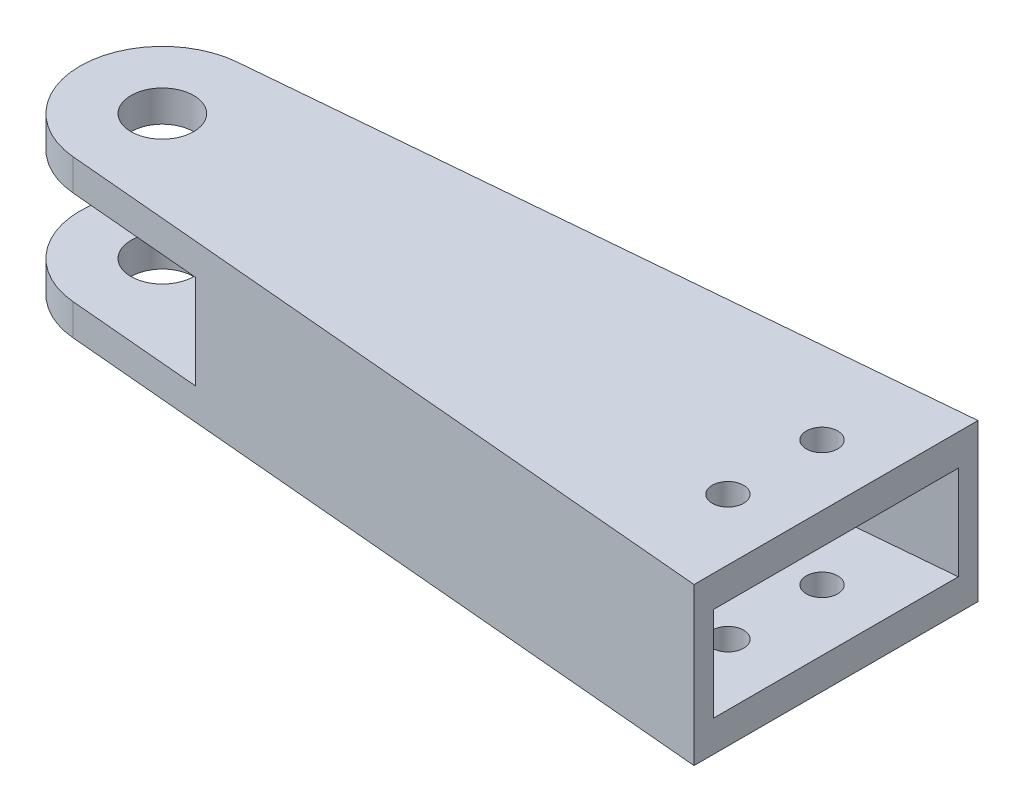
ISO-10303-21;
HEADER;
FILE_DESCRIPTION(('STEP AP214'),'2;1');
FILE_NAME('part.step','',(''),(''),'','','');
FILE_SCHEMA(('AUTOMOTIVE_DESIGN { 1 0 10303 214 1 1 1 1 }'));
ENDSEC;
DATA;
#1=APPLICATION_CONTEXT('core data for automotive mechanical design processes');
#2=APPLICATION_PROTOCOL_DEFINITION('international standard','automotive_design',2000,#1);
#3=PRODUCT_CONTEXT('',#1,'mechanical');
#4=PRODUCT('Part','Part','',(#3));
#5=PRODUCT_RELATED_PRODUCT_CATEGORY('part','',(#4));
#6=PRODUCT_DEFINITION_FORMATION('','',#4);
#7=PRODUCT_DEFINITION_CONTEXT('part definition',#1,'design');
#8=PRODUCT_DEFINITION('design','',#6,#7);
#9=PRODUCT_DEFINITION_SHAPE('','',#8);
#10=(LENGTH_UNIT() NAMED_UNIT(*) SI_UNIT(.MILLI.,.METRE.));
#11=(NAMED_UNIT(*) PLANE_ANGLE_UNIT() SI_UNIT($,.RADIAN.));
#12=(NAMED_UNIT(*) SI_UNIT($,.STERADIAN.) SOLID_ANGLE_UNIT());
#13=UNCERTAINTY_MEASURE_WITH_UNIT(LENGTH_MEASURE(1.E-05),#10,'distance_accuracy_value','');
#14=(GEOMETRIC_REPRESENTATION_CONTEXT(3) GLOBAL_UNCERTAINTY_ASSIGNED_CONTEXT((#13)) GLOBAL_UNIT_ASSIGNED_CONTEXT((#10,
#11,#12)) REPRESENTATION_CONTEXT('',''));
#15=CARTESIAN_POINT('',(0.,0.,0.));
#16=DIRECTION('',(0.,0.,1.));
#17=DIRECTION('',(1.,0.,0.));
#18=AXIS2_PLACEMENT_3D('',#15,#16,#17);
#19=CARTESIAN_POINT('',(0.,4.,0.));
#20=DIRECTION('',(0.,1.,0.));
#21=DIRECTION('',(0.,0.,1.));
#22=AXIS2_PLACEMENT_3D('',#19,#20,#21);
#23=PLANE('',#22);
#24=CARTESIAN_POINT('',(-160.9,4.,0.));
#25=DIRECTION('',(0.,1.,0.));
#26=DIRECTION('',(0.,0.,1.));
#27=AXIS2_PLACEMENT_3D('',#24,#25,#26);
#28=CIRCLE('',#27,3.99999999999999);
#29=CARTESIAN_POINT('',(-160.9,4.,3.99999999999999));
#30=VERTEX_POINT('',#29);
#31=EDGE_CURVE('E187',#30,#30,#28,.T.);
#32=ORIENTED_EDGE('',*,*,#31,.F.);
#33=EDGE_LOOP('',(#32));
#34=FACE_BOUND('',#33,.T.);
#35=DIRECTION('',(-0.0877327517225247,0.,0.996144047954509));
#36=VECTOR('',#35,1.);
#37=CARTESIAN_POINT('',(-142.570436415608,4.,-12.5565140169303));
#38=LINE('',#37,#36);
#39=CARTESIAN_POINT('',(-144.510751477509,4.,9.47440672955096));
#40=VERTEX_POINT('',#39);
#41=CARTESIAN_POINT('',(-144.730083356816,4.,11.9647668494372));
#42=VERTEX_POINT('',#41);
#43=EDGE_CURVE('E174',#40,#42,#38,.T.);
#44=ORIENTED_EDGE('',*,*,#43,.F.);
#45=DIRECTION('',(0.,0.,1.));
#46=VECTOR('',#45,1.);
#47=CARTESIAN_POINT('',(-144.510751477509,4.,-9.47440672955096));
#48=LINE('',#47,#46);
#49=CARTESIAN_POINT('',(-144.510751477509,4.,-9.47440672955096));
#50=VERTEX_POINT('',#49);
#51=EDGE_CURVE('E154',#50,#40,#48,.T.);
#52=ORIENTED_EDGE('',*,*,#51,.F.);
#53=DIRECTION('',(0.0877327517225137,0.,0.996144047954509));
#54=VECTOR('',#53,1.);
#55=CARTESIAN_POINT('',(-142.570436415608,4.,12.5565140169288));
#56=LINE('',#55,#54);
#57=CARTESIAN_POINT('',(-144.730083356816,4.,-11.9647668494372));
#58=VERTEX_POINT('',#57);
#59=EDGE_CURVE('E60',#58,#50,#56,.T.);
#60=ORIENTED_EDGE('',*,*,#59,.F.);
#61=DIRECTION('',(0.996144047954509,0.,-0.0877327517225177));
#62=VECTOR('',#61,1.);
#63=CARTESIAN_POINT('',(-2.15964694120755,4.,-24.5212808663666));
#64=LINE('',#63,#62);
#65=CARTESIAN_POINT('',(-161.821193893086,4.,-10.4595125035224));
#66=VERTEX_POINT('',#65);
#67=EDGE_CURVE('E178',#66,#58,#64,.T.);
#68=ORIENTED_EDGE('',*,*,#67,.F.);
#69=CARTESIAN_POINT('',(-160.9,4.,0.));
#70=DIRECTION('',(0.,1.,0.));
#71=DIRECTION('',(0.,0.,1.));
#72=AXIS2_PLACEMENT_3D('',#69,#70,#71);
#73=CIRCLE('',#72,10.5);
#74=CARTESIAN_POINT('',(-161.821193893086,4.,10.4595125035224));
#75=VERTEX_POINT('',#74);
#76=EDGE_CURVE('E180',#66,#75,#73,.T.);
#77=ORIENTED_EDGE('',*,*,#76,.T.);
#78=DIRECTION('',(0.996144047954509,0.,0.0877327517225177));
#79=VECTOR('',#78,1.);
#80=CARTESIAN_POINT('',(-2.15964694120755,4.,24.5212808663666));
#81=LINE('',#80,#79);
#82=EDGE_CURVE('E183',#75,#42,#81,.T.);
#83=ORIENTED_EDGE('',*,*,#82,.T.);
#84=EDGE_LOOP('',(#44,#52,#60,#68,#77,#83));
#85=FACE_BOUND('',#84,.T.);
#86=ADVANCED_FACE('F37',(#34,#85),#23,.T.);
#87=CARTESIAN_POINT('',(-82.7999999999479,4.,-6.01761447089224));
#88=DIRECTION('',(0.,1.,0.));
#89=DIRECTION('',(0.,0.,1.));
#90=AXIS2_PLACEMENT_3D('',#87,#88,#89);
#91=CIRCLE('',#90,2.);
#92=CARTESIAN_POINT('',(-82.7999999999479,4.,-4.01761447089224));
#93=VERTEX_POINT('',#92);
#94=EDGE_CURVE('E407',#93,#93,#91,.T.);
#95=ORIENTED_EDGE('',*,*,#94,.F.);
#96=EDGE_LOOP('',(#95));
#97=FACE_BOUND('',#96,.T.);
#98=CARTESIAN_POINT('',(-82.7999999999479,4.,5.98238552910776));
#99=DIRECTION('',(0.,1.,0.));
#100=DIRECTION('',(0.,0.,1.));
#101=AXIS2_PLACEMENT_3D('',#98,#99,#100);
#102=CIRCLE('',#101,2.);
#103=CARTESIAN_POINT('',(-82.7999999999479,4.,7.98238552910776));
#104=VERTEX_POINT('',#103);
#105=EDGE_CURVE('E275',#104,#104,#102,.T.);
#106=ORIENTED_EDGE('',*,*,#105,.F.);
#107=EDGE_LOOP('',(#106));
#108=FACE_BOUND('',#107,.T.);
#109=DIRECTION('',(-0.996144047954509,0.,0.0877327517225177));
#110=VECTOR('',#109,1.);
#111=CARTESIAN_POINT('',(-1.94031506190126,4.,-22.0309207464803));
#112=LINE('',#111,#110);
#113=CARTESIAN_POINT('',(-75.,4.,-15.5963822751002));
#114=VERTEX_POINT('',#113);
#115=CARTESIAN_POINT('',(-95.,4.,-13.8349351851403));
#116=VERTEX_POINT('',#115);
#117=EDGE_CURVE('E281',#114,#116,#112,.T.);
#118=ORIENTED_EDGE('',*,*,#117,.T.);
#119=DIRECTION('',(0.,0.,-1.));
#120=VECTOR('',#119,1.);
#121=CARTESIAN_POINT('',(-95.,4.,13.8349351851403));
#122=LINE('',#121,#120);
#123=CARTESIAN_POINT('',(-95.,4.,13.8349351851403));
#124=VERTEX_POINT('',#123);
#125=EDGE_CURVE('E52',#124,#116,#122,.T.);
#126=ORIENTED_EDGE('',*,*,#125,.F.);
#127=DIRECTION('',(0.996144047954509,0.,0.0877327517225177));
#128=VECTOR('',#127,1.);
#129=CARTESIAN_POINT('',(-1.94031506190126,4.,22.0309207464803));
#130=LINE('',#129,#128);
#131=CARTESIAN_POINT('',(-75.,4.,15.5963822751002));
#132=VERTEX_POINT('',#131);
#133=EDGE_CURVE('E153',#124,#132,#130,.T.);
#134=ORIENTED_EDGE('',*,*,#133,.T.);
#135=DIRECTION('',(0.,0.,-1.));
#136=VECTOR('',#135,1.);
#137=CARTESIAN_POINT('',(-75.,4.,0.));
#138=LINE('',#137,#136);
#139=EDGE_CURVE('E185',#132,#114,#138,.T.);
#140=ORIENTED_EDGE('',*,*,#139,.T.);
#141=EDGE_LOOP('',(#118,#126,#134,#140));
#142=FACE_BOUND('',#141,.T.);
#143=ADVANCED_FACE('F299',(#97,#108,#142),#23,.T.);
#144=CARTESIAN_POINT('',(-160.9,16.,0.));
#145=DIRECTION('',(0.,1.,0.));
#146=DIRECTION('',(0.,0.,1.));
#147=AXIS2_PLACEMENT_3D('',#144,#145,#146);
#148=PLANE('',#147);
#149=CARTESIAN_POINT('',(-160.9,16.,0.));
#150=DIRECTION('',(0.,1.,0.));
#151=DIRECTION('',(0.,0.,1.));
#152=AXIS2_PLACEMENT_3D('',#149,#150,#151);
#153=CIRCLE('',#152,3.99999999999999);
#154=CARTESIAN_POINT('',(-160.9,16.,3.99999999999999));
#155=VERTEX_POINT('',#154);
#156=EDGE_CURVE('E280',#155,#155,#153,.T.);
#157=ORIENTED_EDGE('',*,*,#156,.T.);
#158=EDGE_LOOP('',(#157));
#159=FACE_BOUND('',#158,.T.);
#160=DIRECTION('',(0.,0.,1.));
#161=VECTOR('',#160,1.);
#162=CARTESIAN_POINT('',(-144.510751477509,16.,-9.47440672955096));
#163=LINE('',#162,#161);
#164=CARTESIAN_POINT('',(-144.510751477509,16.,-9.47440672955096));
#165=VERTEX_POINT('',#164);
#166=CARTESIAN_POINT('',(-144.510751477509,16.,9.47440672955096));
#167=VERTEX_POINT('',#166);
#168=EDGE_CURVE('E145',#165,#167,#163,.T.);
#169=ORIENTED_EDGE('',*,*,#168,.T.);
#170=DIRECTION('',(-0.0877327517225247,0.,0.996144047954508));
#171=VECTOR('',#170,1.);
#172=CARTESIAN_POINT('',(-142.570436415608,16.,-12.5565140169303));
#173=LINE('',#172,#171);
#174=CARTESIAN_POINT('',(-144.730083356816,16.,11.9647668494372));
#175=VERTEX_POINT('',#174);
#176=EDGE_CURVE('E170',#167,#175,#173,.T.);
#177=ORIENTED_EDGE('',*,*,#176,.T.);
#178=DIRECTION('',(0.996144047954509,0.,0.0877327517225177));
#179=VECTOR('',#178,1.);
#180=CARTESIAN_POINT('',(-161.821193893086,16.,10.4595125035224));
#181=LINE('',#180,#179);
#182=CARTESIAN_POINT('',(-161.821193893086,16.,10.4595125035224));
#183=VERTEX_POINT('',#182);
#184=EDGE_CURVE('E249',#183,#175,#181,.T.);
#185=ORIENTED_EDGE('',*,*,#184,.F.);
#186=CARTESIAN_POINT('',(-160.9,16.,0.));
#187=DIRECTION('',(0.,1.,0.));
#188=DIRECTION('',(0.,0.,1.));
#189=AXIS2_PLACEMENT_3D('',#186,#187,#188);
#190=CIRCLE('',#189,10.5);
#191=CARTESIAN_POINT('',(-161.821193893086,16.,-10.4595125035224));
#192=VERTEX_POINT('',#191);
#193=EDGE_CURVE('E247',#192,#183,#190,.T.);
#194=ORIENTED_EDGE('',*,*,#193,.F.);
#195=DIRECTION('',(-0.996144047954509,0.,0.0877327517225177));
#196=VECTOR('',#195,1.);
#197=CARTESIAN_POINT('',(-75.,16.,-18.1060594700135));
#198=LINE('',#197,#196);
#199=CARTESIAN_POINT('',(-144.730083356816,16.,-11.9647668494372));
#200=VERTEX_POINT('',#199);
#201=EDGE_CURVE('E244',#200,#192,#198,.T.);
#202=ORIENTED_EDGE('',*,*,#201,.F.);
#203=DIRECTION('',(0.0877327517225137,0.,0.996144047954509));
#204=VECTOR('',#203,1.);
#205=CARTESIAN_POINT('',(-142.570436415608,16.,12.5565140169288));
#206=LINE('',#205,#204);
#207=EDGE_CURVE('E270',#200,#165,#206,.T.);
#208=ORIENTED_EDGE('',*,*,#207,.T.);
#209=EDGE_LOOP('',(#169,#177,#185,#194,#202,#208));
#210=FACE_BOUND('',#209,.T.);
#211=ADVANCED_FACE('F259',(#159,#210),#148,.F.);
#212=CARTESIAN_POINT('',(-82.7999999999479,16.,-6.01761447089224));
#213=DIRECTION('',(0.,1.,0.));
#214=DIRECTION('',(0.,0.,1.));
#215=AXIS2_PLACEMENT_3D('',#212,#213,#214);
#216=CIRCLE('',#215,2.);
#217=CARTESIAN_POINT('',(-82.7999999999479,16.,-4.01761447089224));
#218=VERTEX_POINT('',#217);
#219=EDGE_CURVE('E411',#218,#218,#216,.T.);
#220=ORIENTED_EDGE('',*,*,#219,.T.);
#221=EDGE_LOOP('',(#220));
#222=FACE_BOUND('',#221,.T.);
#223=CARTESIAN_POINT('',(-82.7999999999479,16.,5.98238552910776));
#224=DIRECTION('',(0.,1.,0.));
#225=DIRECTION('',(0.,0.,1.));
#226=AXIS2_PLACEMENT_3D('',#223,#224,#225);
#227=CIRCLE('',#226,2.);
#228=CARTESIAN_POINT('',(-82.7999999999479,16.,7.98238552910776));
#229=VERTEX_POINT('',#228);
#230=EDGE_CURVE('E405',#229,#229,#227,.T.);
#231=ORIENTED_EDGE('',*,*,#230,.T.);
#232=EDGE_LOOP('',(#231));
#233=FACE_BOUND('',#232,.T.);
#234=DIRECTION('',(0.,0.,-1.));
#235=VECTOR('',#234,1.);
#236=CARTESIAN_POINT('',(-95.,16.,13.8349351851403));
#237=LINE('',#236,#235);
#238=CARTESIAN_POINT('',(-95.,16.,13.8349351851403));
#239=VERTEX_POINT('',#238);
#240=CARTESIAN_POINT('',(-95.,16.,-13.8349351851403));
#241=VERTEX_POINT('',#240);
#242=EDGE_CURVE('E136',#239,#241,#237,.T.);
#243=ORIENTED_EDGE('',*,*,#242,.T.);
#244=DIRECTION('',(-0.996144047954509,0.,0.0877327517225177));
#245=VECTOR('',#244,1.);
#246=CARTESIAN_POINT('',(-1.94031506190126,16.,-22.0309207464803));
#247=LINE('',#246,#245);
#248=CARTESIAN_POINT('',(-75.,16.,-15.5963822751002));
#249=VERTEX_POINT('',#248);
#250=EDGE_CURVE('E289',#249,#241,#247,.T.);
#251=ORIENTED_EDGE('',*,*,#250,.F.);
#252=DIRECTION('',(0.,0.,-1.));
#253=VECTOR('',#252,1.);
#254=CARTESIAN_POINT('',(-75.,16.,18.1060594700135));
#255=LINE('',#254,#253);
#256=CARTESIAN_POINT('',(-75.,16.,15.5963822751002));
#257=VERTEX_POINT('',#256);
#258=EDGE_CURVE('E159',#257,#249,#255,.T.);
#259=ORIENTED_EDGE('',*,*,#258,.F.);
#260=DIRECTION('',(0.996144047954509,0.,0.0877327517225177));
#261=VECTOR('',#260,1.);
#262=CARTESIAN_POINT('',(-1.94031506190126,16.,22.0309207464803));
#263=LINE('',#262,#261);
#264=EDGE_CURVE('E151',#239,#257,#263,.T.);
#265=ORIENTED_EDGE('',*,*,#264,.F.);
#266=EDGE_LOOP('',(#243,#251,#259,#265));
#267=FACE_BOUND('',#266,.T.);
#268=ADVANCED_FACE('F157',(#222,#233,#267),#148,.F.);
#269=CARTESIAN_POINT('',(-1.94031506190126,86.2622939703821,22.0309207464803));
#270=DIRECTION('',(0.0877327517225177,0.,-0.996144047954509));
#271=DIRECTION('',(-0.996144047954509,0.,-0.0877327517225177));
#272=AXIS2_PLACEMENT_3D('',#269,#270,#271);
#273=PLANE('',#272);
#274=ORIENTED_EDGE('',*,*,#133,.F.);
#275=DIRECTION('',(0.,-1.,0.));
#276=VECTOR('',#275,1.);
#277=CARTESIAN_POINT('',(-95.,72.7180415580072,13.8349351851403));
#278=LINE('',#277,#276);
#279=EDGE_CURVE('E139',#239,#124,#278,.T.);
#280=ORIENTED_EDGE('',*,*,#279,.F.);
#281=ORIENTED_EDGE('',*,*,#264,.T.);
#282=DIRECTION('',(0.,-1.,0.));
#283=VECTOR('',#282,1.);
#284=CARTESIAN_POINT('',(-75.,86.2622939703821,15.5963822751002));
#285=LINE('',#284,#283);
#286=EDGE_CURVE('E160',#257,#132,#285,.T.);
#287=ORIENTED_EDGE('',*,*,#286,.T.);
#288=EDGE_LOOP('',(#274,#280,#281,#287));
#289=FACE_BOUND('',#288,.T.);
#290=ADVANCED_FACE('F149',(#289),#273,.T.);
#291=CARTESIAN_POINT('',(-1.94031506190126,86.2622939703821,-22.0309207464803));
#292=DIRECTION('',(0.0877327517225177,0.,0.996144047954509));
#293=DIRECTION('',(0.996144047954509,0.,-0.0877327517225177));
#294=AXIS2_PLACEMENT_3D('',#291,#292,#293);
#295=PLANE('',#294);
#296=ORIENTED_EDGE('',*,*,#250,.T.);
#297=DIRECTION('',(0.,-1.,0.));
#298=VECTOR('',#297,1.);
#299=CARTESIAN_POINT('',(-95.,72.7180415580072,-13.8349351851403));
#300=LINE('',#299,#298);
#301=EDGE_CURVE('E140',#241,#116,#300,.T.);
#302=ORIENTED_EDGE('',*,*,#301,.T.);
#303=ORIENTED_EDGE('',*,*,#117,.F.);
#304=DIRECTION('',(0.,-1.,0.));
#305=VECTOR('',#304,1.);
#306=CARTESIAN_POINT('',(-75.,86.2622939703821,-15.5963822751002));
#307=LINE('',#306,#305);
#308=EDGE_CURVE('E286',#249,#114,#307,.T.);
#309=ORIENTED_EDGE('',*,*,#308,.F.);
#310=EDGE_LOOP('',(#296,#302,#303,#309));
#311=FACE_BOUND('',#310,.T.);
#312=ADVANCED_FACE('F327',(#311),#295,.T.);
#313=CARTESIAN_POINT('',(-2.15964694120755,4.,-24.5212808663666));
#314=DIRECTION('',(-0.0877327517225177,0.,-0.996144047954509));
#315=DIRECTION('',(-0.996144047954509,0.,0.0877327517225177));
#316=AXIS2_PLACEMENT_3D('',#313,#314,#315);
#317=PLANE('',#316);
#318=DIRECTION('',(0.996144047954509,0.,-0.0877327517225177));
#319=VECTOR('',#318,1.);
#320=CARTESIAN_POINT('',(-2.15964694120755,0.,-24.5212808663666));
#321=LINE('',#320,#319);
#322=CARTESIAN_POINT('',(-161.821193893086,0.,-10.4595125035224));
#323=VERTEX_POINT('',#322);
#324=CARTESIAN_POINT('',(-75.,0.,-18.1060594700135));
#325=VERTEX_POINT('',#324);
#326=EDGE_CURVE('E191',#323,#325,#321,.T.);
#327=ORIENTED_EDGE('',*,*,#326,.F.);
#328=DIRECTION('',(0.,-1.,0.));
#329=VECTOR('',#328,1.);
#330=CARTESIAN_POINT('',(-161.821193893086,4.,-10.4595125035224));
#331=LINE('',#330,#329);
#332=EDGE_CURVE('E11',#66,#323,#331,.T.);
#333=ORIENTED_EDGE('',*,*,#332,.F.);
#334=ORIENTED_EDGE('',*,*,#67,.T.);
#335=DIRECTION('',(0.,-1.,0.));
#336=VECTOR('',#335,1.);
#337=CARTESIAN_POINT('',(-144.730083356816,86.2622939703821,-11.9647668494372));
#338=LINE('',#337,#336);
#339=EDGE_CURVE('E273',#200,#58,#338,.T.);
#340=ORIENTED_EDGE('',*,*,#339,.F.);
#341=ORIENTED_EDGE('',*,*,#201,.T.);
#342=DIRECTION('',(0.,-1.,0.));
#343=VECTOR('',#342,1.);
#344=CARTESIAN_POINT('',(-161.821193893086,20.,-10.4595125035224));
#345=LINE('',#344,#343);
#346=CARTESIAN_POINT('',(-161.821193893086,20.,-10.4595125035224));
#347=VERTEX_POINT('',#346);
#348=EDGE_CURVE('E161',#347,#192,#345,.T.);
#349=ORIENTED_EDGE('',*,*,#348,.F.);
#350=DIRECTION('',(-0.996144047954509,0.,0.0877327517225177));
#351=VECTOR('',#350,1.);
#352=CARTESIAN_POINT('',(-75.,20.,-18.1060594700135));
#353=LINE('',#352,#351);
#354=CARTESIAN_POINT('',(-75.,20.,-18.1060594700135));
#355=VERTEX_POINT('',#354);
#356=EDGE_CURVE('E239',#355,#347,#353,.T.);
#357=ORIENTED_EDGE('',*,*,#356,.F.);
#358=DIRECTION('',(0.,-1.,0.));
#359=VECTOR('',#358,1.);
#360=CARTESIAN_POINT('',(-75.,4.,-18.1060594700135));
#361=LINE('',#360,#359);
#362=EDGE_CURVE('E190',#355,#325,#361,.T.);
#363=ORIENTED_EDGE('',*,*,#362,.T.);
#364=EDGE_LOOP('',(#327,#333,#334,#340,#341,#349,#357,#363));
#365=FACE_BOUND('',#364,.T.);
#366=ADVANCED_FACE('F39',(#365),#317,.T.);
#367=CARTESIAN_POINT('',(-160.9,4.,0.));
#368=DIRECTION('',(0.,-1.,0.));
#369=DIRECTION('',(0.,0.,-1.));
#370=AXIS2_PLACEMENT_3D('',#367,#368,#369);
#371=CYLINDRICAL_SURFACE('',#370,10.5);
#372=CARTESIAN_POINT('',(-160.9,0.,0.));
#373=DIRECTION('',(0.,1.,0.));
#374=DIRECTION('',(0.,0.,1.));
#375=AXIS2_PLACEMENT_3D('',#372,#373,#374);
#376=CIRCLE('',#375,10.5);
#377=CARTESIAN_POINT('',(-161.821193893086,0.,10.4595125035224));
#378=VERTEX_POINT('',#377);
#379=EDGE_CURVE('E194',#323,#378,#376,.T.);
#380=ORIENTED_EDGE('',*,*,#379,.T.);
#381=DIRECTION('',(0.,-1.,0.));
#382=VECTOR('',#381,1.);
#383=CARTESIAN_POINT('',(-161.821193893086,4.,10.4595125035224));
#384=LINE('',#383,#382);
#385=EDGE_CURVE('E45',#75,#378,#384,.T.);
#386=ORIENTED_EDGE('',*,*,#385,.F.);
#387=ORIENTED_EDGE('',*,*,#76,.F.);
#388=ORIENTED_EDGE('',*,*,#332,.T.);
#389=EDGE_LOOP('',(#380,#386,#387,#388));
#390=FACE_BOUND('',#389,.T.);
#391=ADVANCED_FACE('F297',(#390),#371,.T.);
#392=CARTESIAN_POINT('',(-2.15964694120755,4.,24.5212808663666));
#393=DIRECTION('',(0.0877327517225177,0.,-0.996144047954509));
#394=DIRECTION('',(-0.996144047954509,0.,-0.0877327517225177));
#395=AXIS2_PLACEMENT_3D('',#392,#393,#394);
#396=PLANE('',#395);
#397=DIRECTION('',(0.996144047954509,0.,0.0877327517225177));
#398=VECTOR('',#397,1.);
#399=CARTESIAN_POINT('',(-2.15964694120755,0.,24.5212808663666));
#400=LINE('',#399,#398);
#401=CARTESIAN_POINT('',(-75.,0.,18.1060594700135));
#402=VERTEX_POINT('',#401);
#403=EDGE_CURVE('E196',#378,#402,#400,.T.);
#404=ORIENTED_EDGE('',*,*,#403,.T.);
#405=DIRECTION('',(0.,-1.,0.));
#406=VECTOR('',#405,1.);
#407=CARTESIAN_POINT('',(-75.,4.,18.1060594700135));
#408=LINE('',#407,#406);
#409=CARTESIAN_POINT('',(-75.,20.,18.1060594700135));
#410=VERTEX_POINT('',#409);
#411=EDGE_CURVE('E204',#410,#402,#408,.T.);
#412=ORIENTED_EDGE('',*,*,#411,.F.);
#413=DIRECTION('',(0.996144047954509,0.,0.0877327517225177));
#414=VECTOR('',#413,1.);
#415=CARTESIAN_POINT('',(-161.821193893086,20.,10.4595125035224));
#416=LINE('',#415,#414);
#417=CARTESIAN_POINT('',(-161.821193893086,20.,10.4595125035224));
#418=VERTEX_POINT('',#417);
#419=EDGE_CURVE('E230',#418,#410,#416,.T.);
#420=ORIENTED_EDGE('',*,*,#419,.F.);
#421=DIRECTION('',(0.,-1.,0.));
#422=VECTOR('',#421,1.);
#423=CARTESIAN_POINT('',(-161.821193893086,20.,10.4595125035224));
#424=LINE('',#423,#422);
#425=EDGE_CURVE('E166',#418,#183,#424,.T.);
#426=ORIENTED_EDGE('',*,*,#425,.T.);
#427=ORIENTED_EDGE('',*,*,#184,.T.);
#428=DIRECTION('',(0.,-1.,0.));
#429=VECTOR('',#428,1.);
#430=CARTESIAN_POINT('',(-144.730083356816,86.2622939703821,11.9647668494372));
#431=LINE('',#430,#429);
#432=EDGE_CURVE('E175',#175,#42,#431,.T.);
#433=ORIENTED_EDGE('',*,*,#432,.T.);
#434=ORIENTED_EDGE('',*,*,#82,.F.);
#435=ORIENTED_EDGE('',*,*,#385,.T.);
#436=EDGE_LOOP('',(#404,#412,#420,#426,#427,#433,#434,#435));
#437=FACE_BOUND('',#436,.T.);
#438=ADVANCED_FACE('F211',(#437),#396,.F.);
#439=CARTESIAN_POINT('',(-75.,4.,0.));
#440=DIRECTION('',(-1.,0.,0.));
#441=DIRECTION('',(0.,0.,1.));
#442=AXIS2_PLACEMENT_3D('',#439,#440,#441);
#443=PLANE('',#442);
#444=ORIENTED_EDGE('',*,*,#362,.F.);
#445=DIRECTION('',(0.,0.,-1.));
#446=VECTOR('',#445,1.);
#447=CARTESIAN_POINT('',(-75.,20.,18.1060594700135));
#448=LINE('',#447,#446);
#449=EDGE_CURVE('E226',#410,#355,#448,.T.);
#450=ORIENTED_EDGE('',*,*,#449,.F.);
#451=ORIENTED_EDGE('',*,*,#411,.T.);
#452=DIRECTION('',(0.,0.,-1.));
#453=VECTOR('',#452,1.);
#454=CARTESIAN_POINT('',(-75.,0.,0.));
#455=LINE('',#454,#453);
#456=EDGE_CURVE('E198',#402,#325,#455,.T.);
#457=ORIENTED_EDGE('',*,*,#456,.T.);
#458=EDGE_LOOP('',(#444,#450,#451,#457));
#459=FACE_BOUND('',#458,.T.);
#460=ORIENTED_EDGE('',*,*,#308,.T.);
#461=ORIENTED_EDGE('',*,*,#139,.F.);
#462=ORIENTED_EDGE('',*,*,#286,.F.);
#463=ORIENTED_EDGE('',*,*,#258,.T.);
#464=EDGE_LOOP('',(#460,#461,#462,#463));
#465=FACE_BOUND('',#464,.T.);
#466=ADVANCED_FACE('F221',(#459,#465),#443,.F.);
#467=CARTESIAN_POINT('',(-160.9,4.,0.));
#468=DIRECTION('',(0.,-1.,0.));
#469=DIRECTION('',(0.,0.,-1.));
#470=AXIS2_PLACEMENT_3D('',#467,#468,#469);
#471=CYLINDRICAL_SURFACE('',#470,3.99999999999999);
#472=ORIENTED_EDGE('',*,*,#31,.T.);
#473=EDGE_LOOP('',(#472));
#474=FACE_BOUND('',#473,.T.);
#475=CARTESIAN_POINT('',(-160.9,0.,0.));
#476=DIRECTION('',(0.,1.,0.));
#477=DIRECTION('',(0.,0.,1.));
#478=AXIS2_PLACEMENT_3D('',#475,#476,#477);
#479=CIRCLE('',#478,3.99999999999999);
#480=CARTESIAN_POINT('',(-160.9,0.,3.99999999999999));
#481=VERTEX_POINT('',#480);
#482=EDGE_CURVE('E181',#481,#481,#479,.T.);
#483=ORIENTED_EDGE('',*,*,#482,.F.);
#484=EDGE_LOOP('',(#483));
#485=FACE_BOUND('',#484,.T.);
#486=ADVANCED_FACE('F315',(#474,#485),#471,.F.);
#487=CARTESIAN_POINT('',(0.,0.,0.));
#488=DIRECTION('',(0.,1.,0.));
#489=DIRECTION('',(0.,0.,1.));
#490=AXIS2_PLACEMENT_3D('',#487,#488,#489);
#491=PLANE('',#490);
#492=CARTESIAN_POINT('',(-82.7999999999479,0.,5.98238552910776));
#493=DIRECTION('',(0.,-1.,0.));
#494=DIRECTION('',(0.,0.,-1.));
#495=AXIS2_PLACEMENT_3D('',#492,#493,#494);
#496=CIRCLE('',#495,2.);
#497=CARTESIAN_POINT('',(-82.7999999999479,0.,3.98238552910776));
#498=VERTEX_POINT('',#497);
#499=EDGE_CURVE('E423',#498,#498,#496,.T.);
#500=ORIENTED_EDGE('',*,*,#499,.F.);
#501=EDGE_LOOP('',(#500));
#502=FACE_BOUND('',#501,.T.);
#503=CARTESIAN_POINT('',(-82.7999999999479,0.,-6.01761447089224));
#504=DIRECTION('',(0.,-1.,0.));
#505=DIRECTION('',(0.,0.,-1.));
#506=AXIS2_PLACEMENT_3D('',#503,#504,#505);
#507=CIRCLE('',#506,2.);
#508=CARTESIAN_POINT('',(-82.7999999999479,0.,-8.01761447089224));
#509=VERTEX_POINT('',#508);
#510=EDGE_CURVE('E419',#509,#509,#507,.T.);
#511=ORIENTED_EDGE('',*,*,#510,.F.);
#512=EDGE_LOOP('',(#511));
#513=FACE_BOUND('',#512,.T.);
#514=ORIENTED_EDGE('',*,*,#326,.T.);
#515=ORIENTED_EDGE('',*,*,#456,.F.);
#516=ORIENTED_EDGE('',*,*,#403,.F.);
#517=ORIENTED_EDGE('',*,*,#379,.F.);
#518=EDGE_LOOP('',(#514,#515,#516,#517));
#519=FACE_BOUND('',#518,.T.);
#520=ORIENTED_EDGE('',*,*,#482,.T.);
#521=EDGE_LOOP('',(#520));
#522=FACE_BOUND('',#521,.T.);
#523=ADVANCED_FACE('F217',(#502,#513,#519,#522),#491,.F.);
#524=CARTESIAN_POINT('',(-142.570436415608,86.2622939703821,-12.5565140169303));
#525=DIRECTION('',(0.996144047954508,0.,0.0877327517225247));
#526=DIRECTION('',(0.0877327517225247,0.,-0.996144047954508));
#527=AXIS2_PLACEMENT_3D('',#524,#525,#526);
#528=PLANE('',#527);
#529=ORIENTED_EDGE('',*,*,#176,.F.);
#530=DIRECTION('',(0.,-1.,0.));
#531=VECTOR('',#530,1.);
#532=CARTESIAN_POINT('',(-144.510751477509,86.2622939703821,9.47440672955096));
#533=LINE('',#532,#531);
#534=EDGE_CURVE('E163',#167,#40,#533,.T.);
#535=ORIENTED_EDGE('',*,*,#534,.T.);
#536=ORIENTED_EDGE('',*,*,#43,.T.);
#537=ORIENTED_EDGE('',*,*,#432,.F.);
#538=EDGE_LOOP('',(#529,#535,#536,#537));
#539=FACE_BOUND('',#538,.T.);
#540=ADVANCED_FACE('F314',(#539),#528,.F.);
#541=CARTESIAN_POINT('',(-160.9,20.,0.));
#542=DIRECTION('',(0.,1.,0.));
#543=DIRECTION('',(0.,0.,1.));
#544=AXIS2_PLACEMENT_3D('',#541,#542,#543);
#545=PLANE('',#544);
#546=CARTESIAN_POINT('',(-82.7999999999479,20.,5.98238552910776));
#547=DIRECTION('',(0.,-1.,0.));
#548=DIRECTION('',(0.,0.,-1.));
#549=AXIS2_PLACEMENT_3D('',#546,#547,#548);
#550=CIRCLE('',#549,2.);
#551=CARTESIAN_POINT('',(-82.7999999999479,20.,3.98238552910776));
#552=VERTEX_POINT('',#551);
#553=EDGE_CURVE('E402',#552,#552,#550,.T.);
#554=ORIENTED_EDGE('',*,*,#553,.T.);
#555=EDGE_LOOP('',(#554));
#556=FACE_BOUND('',#555,.T.);
#557=CARTESIAN_POINT('',(-82.7999999999479,20.,-6.01761447089224));
#558=DIRECTION('',(0.,-1.,0.));
#559=DIRECTION('',(0.,0.,-1.));
#560=AXIS2_PLACEMENT_3D('',#557,#558,#559);
#561=CIRCLE('',#560,2.);
#562=CARTESIAN_POINT('',(-82.7999999999479,20.,-8.01761447089224));
#563=VERTEX_POINT('',#562);
#564=EDGE_CURVE('E426',#563,#563,#561,.T.);
#565=ORIENTED_EDGE('',*,*,#564,.T.);
#566=EDGE_LOOP('',(#565));
#567=FACE_BOUND('',#566,.T.);
#568=ORIENTED_EDGE('',*,*,#449,.T.);
#569=ORIENTED_EDGE('',*,*,#356,.T.);
#570=CARTESIAN_POINT('',(-160.9,20.,0.));
#571=DIRECTION('',(0.,1.,0.));
#572=DIRECTION('',(0.,0.,1.));
#573=AXIS2_PLACEMENT_3D('',#570,#571,#572);
#574=CIRCLE('',#573,10.5);
#575=EDGE_CURVE('E235',#347,#418,#574,.T.);
#576=ORIENTED_EDGE('',*,*,#575,.T.);
#577=ORIENTED_EDGE('',*,*,#419,.T.);
#578=EDGE_LOOP('',(#568,#569,#576,#577));
#579=FACE_BOUND('',#578,.T.);
#580=CARTESIAN_POINT('',(-160.9,20.,0.));
#581=DIRECTION('',(0.,1.,0.));
#582=DIRECTION('',(0.,0.,1.));
#583=AXIS2_PLACEMENT_3D('',#580,#581,#582);
#584=CIRCLE('',#583,3.99999999999999);
#585=CARTESIAN_POINT('',(-160.9,20.,3.99999999999999));
#586=VERTEX_POINT('',#585);
#587=EDGE_CURVE('E245',#586,#586,#584,.T.);
#588=ORIENTED_EDGE('',*,*,#587,.F.);
#589=EDGE_LOOP('',(#588));
#590=FACE_BOUND('',#589,.T.);
#591=ADVANCED_FACE('F232',(#556,#567,#579,#590),#545,.T.);
#592=CARTESIAN_POINT('',(-160.9,20.,0.));
#593=DIRECTION('',(0.,-1.,0.));
#594=DIRECTION('',(0.,0.,-1.));
#595=AXIS2_PLACEMENT_3D('',#592,#593,#594);
#596=CYLINDRICAL_SURFACE('',#595,10.5);
#597=ORIENTED_EDGE('',*,*,#193,.T.);
#598=ORIENTED_EDGE('',*,*,#425,.F.);
#599=ORIENTED_EDGE('',*,*,#575,.F.);
#600=ORIENTED_EDGE('',*,*,#348,.T.);
#601=EDGE_LOOP('',(#597,#598,#599,#600));
#602=FACE_BOUND('',#601,.T.);
#603=ADVANCED_FACE('F266',(#602),#596,.T.);
#604=CARTESIAN_POINT('',(-160.9,20.,0.));
#605=DIRECTION('',(0.,-1.,0.));
#606=DIRECTION('',(0.,0.,-1.));
#607=AXIS2_PLACEMENT_3D('',#604,#605,#606);
#608=CYLINDRICAL_SURFACE('',#607,3.99999999999999);
#609=ORIENTED_EDGE('',*,*,#587,.T.);
#610=EDGE_LOOP('',(#609));
#611=FACE_BOUND('',#610,.T.);
#612=ORIENTED_EDGE('',*,*,#156,.F.);
#613=EDGE_LOOP('',(#612));
#614=FACE_BOUND('',#613,.T.);
#615=ADVANCED_FACE('F344',(#611,#614),#608,.F.);
#616=CARTESIAN_POINT('',(-142.570436415608,86.2622939703821,12.5565140169288));
#617=DIRECTION('',(0.996144047954509,0.,-0.0877327517225136));
#618=DIRECTION('',(-0.0877327517225137,0.,-0.996144047954509));
#619=AXIS2_PLACEMENT_3D('',#616,#617,#618);
#620=PLANE('',#619);
#621=ORIENTED_EDGE('',*,*,#207,.F.);
#622=ORIENTED_EDGE('',*,*,#339,.T.);
#623=ORIENTED_EDGE('',*,*,#59,.T.);
#624=DIRECTION('',(0.,-1.,0.));
#625=VECTOR('',#624,1.);
#626=CARTESIAN_POINT('',(-144.510751477509,86.2622939703821,-9.47440672955096));
#627=LINE('',#626,#625);
#628=EDGE_CURVE('E279',#165,#50,#627,.T.);
#629=ORIENTED_EDGE('',*,*,#628,.F.);
#630=EDGE_LOOP('',(#621,#622,#623,#629));
#631=FACE_BOUND('',#630,.T.);
#632=ADVANCED_FACE('F277',(#631),#620,.F.);
#633=CARTESIAN_POINT('',(-82.7999999999479,20.,-6.01761447089224));
#634=DIRECTION('',(0.,-1.,0.));
#635=DIRECTION('',(0.,0.,-1.));
#636=AXIS2_PLACEMENT_3D('',#633,#634,#635);
#637=CYLINDRICAL_SURFACE('',#636,2.);
#638=ORIENTED_EDGE('',*,*,#564,.F.);
#639=EDGE_LOOP('',(#638));
#640=FACE_BOUND('',#639,.T.);
#641=ORIENTED_EDGE('',*,*,#219,.F.);
#642=EDGE_LOOP('',(#641));
#643=FACE_BOUND('',#642,.T.);
#644=ADVANCED_FACE('F343',(#640,#643),#637,.F.);
#645=CARTESIAN_POINT('',(-82.7999999999479,20.,5.98238552910776));
#646=DIRECTION('',(0.,-1.,0.));
#647=DIRECTION('',(0.,0.,-1.));
#648=AXIS2_PLACEMENT_3D('',#645,#646,#647);
#649=CYLINDRICAL_SURFACE('',#648,2.);
#650=ORIENTED_EDGE('',*,*,#553,.F.);
#651=EDGE_LOOP('',(#650));
#652=FACE_BOUND('',#651,.T.);
#653=ORIENTED_EDGE('',*,*,#230,.F.);
#654=EDGE_LOOP('',(#653));
#655=FACE_BOUND('',#654,.T.);
#656=ADVANCED_FACE('F387',(#652,#655),#649,.F.);
#657=ORIENTED_EDGE('',*,*,#94,.T.);
#658=EDGE_LOOP('',(#657));
#659=FACE_BOUND('',#658,.T.);
#660=ORIENTED_EDGE('',*,*,#510,.T.);
#661=EDGE_LOOP('',(#660));
#662=FACE_BOUND('',#661,.T.);
#663=ADVANCED_FACE('F339',(#659,#662),#637,.F.);
#664=ORIENTED_EDGE('',*,*,#105,.T.);
#665=EDGE_LOOP('',(#664));
#666=FACE_BOUND('',#665,.T.);
#667=ORIENTED_EDGE('',*,*,#499,.T.);
#668=EDGE_LOOP('',(#667));
#669=FACE_BOUND('',#668,.T.);
#670=ADVANCED_FACE('F372',(#666,#669),#649,.F.);
#671=CARTESIAN_POINT('',(-95.,72.7180415580072,13.8349351851403));
#672=DIRECTION('',(-1.,0.,0.));
#673=DIRECTION('',(0.,0.,1.));
#674=AXIS2_PLACEMENT_3D('',#671,#672,#673);
#675=PLANE('',#674);
#676=ORIENTED_EDGE('',*,*,#242,.F.);
#677=ORIENTED_EDGE('',*,*,#279,.T.);
#678=ORIENTED_EDGE('',*,*,#125,.T.);
#679=ORIENTED_EDGE('',*,*,#301,.F.);
#680=EDGE_LOOP('',(#676,#677,#678,#679));
#681=FACE_BOUND('',#680,.T.);
#682=ADVANCED_FACE('F138',(#681),#675,.F.);
#683=CARTESIAN_POINT('',(-144.510751477509,72.7180415580072,-9.47440672955096));
#684=DIRECTION('',(1.,0.,0.));
#685=DIRECTION('',(0.,0.,-1.));
#686=AXIS2_PLACEMENT_3D('',#683,#684,#685);
#687=PLANE('',#686);
#688=ORIENTED_EDGE('',*,*,#168,.F.);
#689=ORIENTED_EDGE('',*,*,#628,.T.);
#690=ORIENTED_EDGE('',*,*,#51,.T.);
#691=ORIENTED_EDGE('',*,*,#534,.F.);
#692=EDGE_LOOP('',(#688,#689,#690,#691));
#693=FACE_BOUND('',#692,.T.);
#694=ADVANCED_FACE('F371',(#693),#687,.F.);
#695=CLOSED_SHELL('',(#86,#143,#211,#268,#290,#312,#366,#391,#438,#466,#486,#523,#540,#591,#603,
#615,#632,#644,#656,#663,#670,#682,#694));
#696=MANIFOLD_SOLID_BREP('B2',#695);
#697=ADVANCED_BREP_SHAPE_REPRESENTATION('',(#18,#696),#14);
#698=SHAPE_DEFINITION_REPRESENTATION(#9,#697);
ENDSEC;
END-ISO-10303-21;
